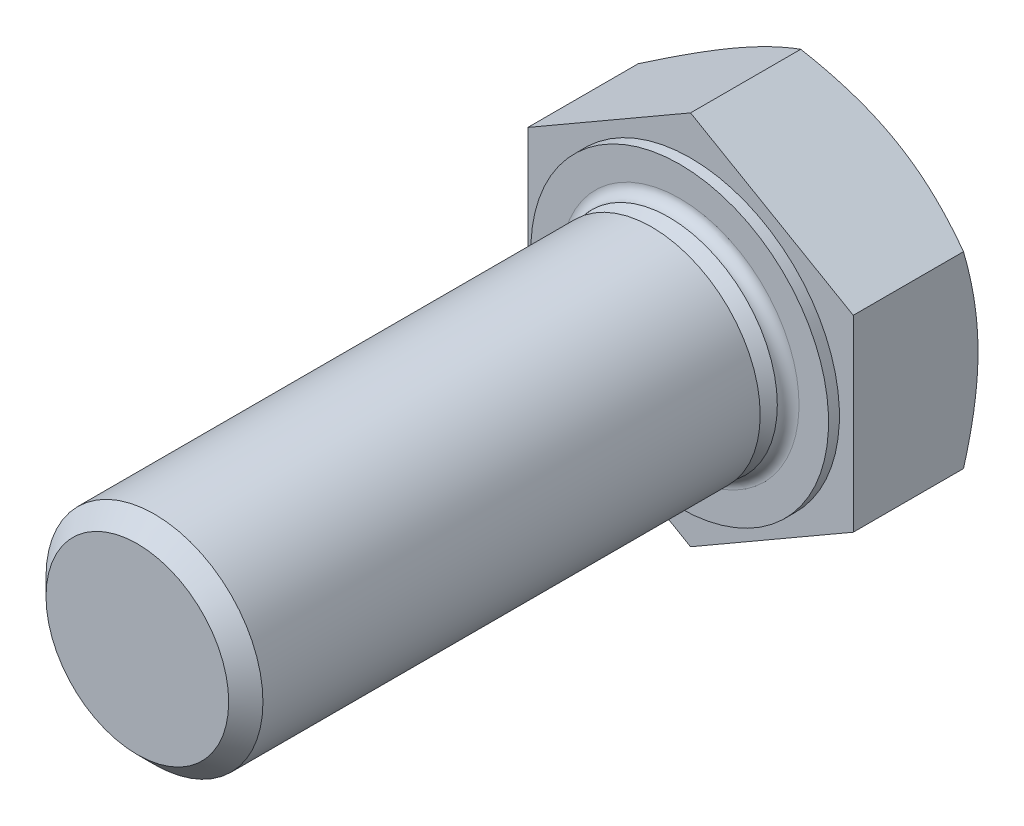
ISO-10303-21;
HEADER;
FILE_DESCRIPTION(('STEP AP214'),'2;1');
FILE_NAME('part.step','',(''),(''),'','','');
FILE_SCHEMA(('AUTOMOTIVE_DESIGN { 1 0 10303 214 1 1 1 1 }'));
ENDSEC;
DATA;
#1=APPLICATION_CONTEXT('core data for automotive mechanical design processes');
#2=APPLICATION_PROTOCOL_DEFINITION('international standard','automotive_design',2000,#1);
#3=PRODUCT_CONTEXT('',#1,'mechanical');
#4=PRODUCT('Part','Part','',(#3));
#5=PRODUCT_RELATED_PRODUCT_CATEGORY('part','',(#4));
#6=PRODUCT_DEFINITION_FORMATION('','',#4);
#7=PRODUCT_DEFINITION_CONTEXT('part definition',#1,'design');
#8=PRODUCT_DEFINITION('design','',#6,#7);
#9=PRODUCT_DEFINITION_SHAPE('','',#8);
#10=(LENGTH_UNIT() NAMED_UNIT(*) SI_UNIT(.MILLI.,.METRE.));
#11=(NAMED_UNIT(*) PLANE_ANGLE_UNIT() SI_UNIT($,.RADIAN.));
#12=(NAMED_UNIT(*) SI_UNIT($,.STERADIAN.) SOLID_ANGLE_UNIT());
#13=UNCERTAINTY_MEASURE_WITH_UNIT(LENGTH_MEASURE(1.E-05),#10,'distance_accuracy_value','');
#14=(GEOMETRIC_REPRESENTATION_CONTEXT(3) GLOBAL_UNCERTAINTY_ASSIGNED_CONTEXT((#13)) GLOBAL_UNIT_ASSIGNED_CONTEXT((#10,
#11,#12)) REPRESENTATION_CONTEXT('',''));
#15=CARTESIAN_POINT('',(0.,0.,0.));
#16=DIRECTION('',(0.,0.,1.));
#17=DIRECTION('',(1.,0.,0.));
#18=AXIS2_PLACEMENT_3D('',#15,#16,#17);
#19=CARTESIAN_POINT('',(0.,2.52640625,30.));
#20=DIRECTION('',(0.,0.,1.));
#21=DIRECTION('',(0.,1.,0.));
#22=AXIS2_PLACEMENT_3D('',#19,#20,#21);
#23=PLANE('',#22);
#24=CARTESIAN_POINT('',(0.,0.,30.));
#25=DIRECTION('',(0.,0.,1.));
#26=DIRECTION('',(0.,1.,0.));
#27=AXIS2_PLACEMENT_3D('',#24,#25,#26);
#28=CIRCLE('',#27,5.0528125);
#29=CARTESIAN_POINT('',(0.,5.0528125,30.));
#30=VERTEX_POINT('',#29);
#31=EDGE_CURVE('E9',#30,#30,#28,.T.);
#32=ORIENTED_EDGE('',*,*,#31,.T.);
#33=EDGE_LOOP('',(#32));
#34=FACE_BOUND('',#33,.T.);
#35=ADVANCED_FACE('F15',(#34),#23,.T.);
#36=CARTESIAN_POINT('',(0.,0.,29.52640625));
#37=DIRECTION('',(0.,0.,-1.));
#38=DIRECTION('',(0.,1.,0.));
#39=AXIS2_PLACEMENT_3D('',#36,#37,#38);
#40=CONICAL_SURFACE('',#39,5.52640625,0.785398163397449);
#41=CARTESIAN_POINT('',(0.,0.,29.0528125));
#42=DIRECTION('',(0.,0.,1.));
#43=DIRECTION('',(0.,1.,0.));
#44=AXIS2_PLACEMENT_3D('',#41,#42,#43);
#45=CIRCLE('',#44,6.);
#46=CARTESIAN_POINT('',(0.,6.,29.0528125));
#47=VERTEX_POINT('',#46);
#48=EDGE_CURVE('E24',#47,#47,#45,.T.);
#49=ORIENTED_EDGE('',*,*,#48,.T.);
#50=EDGE_LOOP('',(#49));
#51=FACE_BOUND('',#50,.T.);
#52=ORIENTED_EDGE('',*,*,#31,.F.);
#53=EDGE_LOOP('',(#52));
#54=FACE_BOUND('',#53,.T.);
#55=ADVANCED_FACE('F275',(#51,#54),#40,.T.);
#56=CARTESIAN_POINT('',(0.,0.,15.3));
#57=DIRECTION('',(0.,0.,-1.));
#58=DIRECTION('',(0.,1.,0.));
#59=AXIS2_PLACEMENT_3D('',#56,#57,#58);
#60=CYLINDRICAL_SURFACE('',#59,6.);
#61=CARTESIAN_POINT('',(0.,0.,1.5471875));
#62=DIRECTION('',(0.,0.,1.));
#63=DIRECTION('',(0.,1.,0.));
#64=AXIS2_PLACEMENT_3D('',#61,#62,#63);
#65=CIRCLE('',#64,6.);
#66=CARTESIAN_POINT('',(0.,6.,1.5471875));
#67=VERTEX_POINT('',#66);
#68=EDGE_CURVE('E110',#67,#67,#65,.T.);
#69=ORIENTED_EDGE('',*,*,#68,.T.);
#70=EDGE_LOOP('',(#69));
#71=FACE_BOUND('',#70,.T.);
#72=ORIENTED_EDGE('',*,*,#48,.F.);
#73=EDGE_LOOP('',(#72));
#74=FACE_BOUND('',#73,.T.);
#75=ADVANCED_FACE('F280',(#71,#74),#60,.T.);
#76=CARTESIAN_POINT('',(0.,5.52640625,1.5471875));
#77=DIRECTION('',(0.,0.,-1.));
#78=DIRECTION('',(0.,-1.,0.));
#79=AXIS2_PLACEMENT_3D('',#76,#77,#78);
#80=PLANE('',#79);
#81=CARTESIAN_POINT('',(0.,0.,1.5471875));
#82=DIRECTION('',(0.,0.,1.));
#83=DIRECTION('',(0.,1.,0.));
#84=AXIS2_PLACEMENT_3D('',#81,#82,#83);
#85=CIRCLE('',#84,5.0528125);
#86=CARTESIAN_POINT('',(0.,5.0528125,1.5471875));
#87=VERTEX_POINT('',#86);
#88=EDGE_CURVE('E106',#87,#87,#85,.T.);
#89=ORIENTED_EDGE('',*,*,#88,.T.);
#90=EDGE_LOOP('',(#89));
#91=FACE_BOUND('',#90,.T.);
#92=ORIENTED_EDGE('',*,*,#68,.F.);
#93=EDGE_LOOP('',(#92));
#94=FACE_BOUND('',#93,.T.);
#95=ADVANCED_FACE('F107',(#91,#94),#80,.T.);
#96=CARTESIAN_POINT('',(0.,0.,1.07359375));
#97=DIRECTION('',(0.,0.,-1.));
#98=DIRECTION('',(0.,1.,0.));
#99=AXIS2_PLACEMENT_3D('',#96,#97,#98);
#100=CONICAL_SURFACE('',#99,5.52640625,0.785398163397448);
#101=CARTESIAN_POINT('',(0.,0.,0.6));
#102=DIRECTION('',(0.,0.,1.));
#103=DIRECTION('',(0.,1.,0.));
#104=AXIS2_PLACEMENT_3D('',#101,#102,#103);
#105=CIRCLE('',#104,6.);
#106=CARTESIAN_POINT('',(0.,6.,0.6));
#107=VERTEX_POINT('',#106);
#108=EDGE_CURVE('E111',#107,#107,#105,.T.);
#109=ORIENTED_EDGE('',*,*,#108,.T.);
#110=EDGE_LOOP('',(#109));
#111=FACE_BOUND('',#110,.T.);
#112=ORIENTED_EDGE('',*,*,#88,.F.);
#113=EDGE_LOOP('',(#112));
#114=FACE_BOUND('',#113,.T.);
#115=ADVANCED_FACE('F271',(#111,#114),#100,.T.);
#116=CARTESIAN_POINT('',(0.,0.,0.6));
#117=DIRECTION('',(0.,0.,1.));
#118=DIRECTION('',(1.,0.,0.));
#119=AXIS2_PLACEMENT_3D('',#116,#117,#118);
#120=TOROIDAL_SURFACE('',#119,6.6,0.6);
#121=CARTESIAN_POINT('',(0.,0.,0.));
#122=DIRECTION('',(0.,0.,1.));
#123=DIRECTION('',(0.,1.,0.));
#124=AXIS2_PLACEMENT_3D('',#121,#122,#123);
#125=CIRCLE('',#124,6.6);
#126=CARTESIAN_POINT('',(0.,6.6,0.));
#127=VERTEX_POINT('',#126);
#128=EDGE_CURVE('E114',#127,#127,#125,.T.);
#129=ORIENTED_EDGE('',*,*,#128,.T.);
#130=EDGE_LOOP('',(#129));
#131=FACE_BOUND('',#130,.T.);
#132=ORIENTED_EDGE('',*,*,#108,.F.);
#133=EDGE_LOOP('',(#132));
#134=FACE_BOUND('',#133,.T.);
#135=ADVANCED_FACE('F257',(#131,#134),#120,.F.);
#136=CARTESIAN_POINT('',(0.,7.4175,0.));
#137=DIRECTION('',(0.,0.,1.));
#138=DIRECTION('',(0.,1.,0.));
#139=AXIS2_PLACEMENT_3D('',#136,#137,#138);
#140=PLANE('',#139);
#141=CARTESIAN_POINT('',(0.,0.,0.));
#142=DIRECTION('',(0.,0.,1.));
#143=DIRECTION('',(0.,1.,0.));
#144=AXIS2_PLACEMENT_3D('',#141,#142,#143);
#145=CIRCLE('',#144,8.235);
#146=CARTESIAN_POINT('',(0.,8.235,0.));
#147=VERTEX_POINT('',#146);
#148=EDGE_CURVE('E148',#147,#147,#145,.T.);
#149=ORIENTED_EDGE('',*,*,#148,.T.);
#150=EDGE_LOOP('',(#149));
#151=FACE_BOUND('',#150,.T.);
#152=ORIENTED_EDGE('',*,*,#128,.F.);
#153=EDGE_LOOP('',(#152));
#154=FACE_BOUND('',#153,.T.);
#155=ADVANCED_FACE('F260',(#151,#154),#140,.T.);
#156=CARTESIAN_POINT('',(0.,0.,-0.55));
#157=DIRECTION('',(0.,0.,-1.));
#158=DIRECTION('',(0.,1.,0.));
#159=AXIS2_PLACEMENT_3D('',#156,#157,#158);
#160=CYLINDRICAL_SURFACE('',#159,8.235);
#161=ORIENTED_EDGE('',*,*,#148,.F.);
#162=EDGE_LOOP('',(#161));
#163=FACE_BOUND('',#162,.T.);
#164=CARTESIAN_POINT('',(0.,0.,-0.6));
#165=DIRECTION('',(0.,0.,1.));
#166=DIRECTION('',(0.,1.,0.));
#167=AXIS2_PLACEMENT_3D('',#164,#165,#166);
#168=CIRCLE('',#167,8.235);
#169=CARTESIAN_POINT('',(0.,-8.235,-0.6));
#170=VERTEX_POINT('',#169);
#171=EDGE_CURVE('E161',#170,#170,#168,.T.);
#172=ORIENTED_EDGE('',*,*,#171,.T.);
#173=EDGE_LOOP('',(#172));
#174=FACE_BOUND('',#173,.T.);
#175=ADVANCED_FACE('F17',(#163,#174),#160,.T.);
#176=CARTESIAN_POINT('',(-4.5,-7.79422863405995,0.4));
#177=DIRECTION('',(-0.5,-0.866025403784439,0.));
#178=DIRECTION('',(-0.866025403784439,0.5,0.));
#179=AXIS2_PLACEMENT_3D('',#176,#177,#178);
#180=PLANE('',#179);
#181=CARTESIAN_POINT('',(0.00466633059542045,-10.3949989526387,-6.69459637448047));
#182=CARTESIAN_POINT('',(-2.4096675960114,-9.00108261019856,-7.49999999999999));
#183=CARTESIAN_POINT('',(-4.5,-7.79422863405995,-7.5));
#184=CARTESIAN_POINT('',(-6.59033240398861,-6.58737465792134,-7.50000000000001));
#185=CARTESIAN_POINT('',(-9.00466633059542,-5.19345831548124,-6.69459637448047));
#186=(BOUNDED_CURVE() B_SPLINE_CURVE(2,(#181,#182,#183,#184,#185),.UNSPECIFIED.,.F.,
.F.) B_SPLINE_CURVE_WITH_KNOTS((3,2,3),(0.,5.27698475776278,10.5539695155256),
.UNSPECIFIED.) CURVE() GEOMETRIC_REPRESENTATION_ITEM() RATIONAL_B_SPLINE_CURVE((1.,
1.03802697460135,1.,1.03802697460134,1.)) REPRESENTATION_ITEM(''));
#187=CARTESIAN_POINT('',(0.,-10.3923048454133,-6.69615242270663));
#188=VERTEX_POINT('',#187);
#189=CARTESIAN_POINT('',(-4.5,-7.79422863405995,-7.5));
#190=VERTEX_POINT('',#189);
#191=EDGE_CURVE('E202',#188,#190,#186,.T.);
#192=ORIENTED_EDGE('',*,*,#191,.F.);
#193=DIRECTION('',(0.,0.,-1.));
#194=VECTOR('',#193,1.);
#195=CARTESIAN_POINT('',(0.,-10.3923048454133,0.4));
#196=LINE('',#195,#194);
#197=CARTESIAN_POINT('',(0.,-10.3923048454133,-0.6));
#198=VERTEX_POINT('',#197);
#199=EDGE_CURVE('E150',#198,#188,#196,.T.);
#200=ORIENTED_EDGE('',*,*,#199,.F.);
#201=DIRECTION('',(0.866025403784439,-0.5,0.));
#202=VECTOR('',#201,1.);
#203=CARTESIAN_POINT('',(-3.3747082409576,-8.44391613405995,-0.6));
#204=LINE('',#203,#202);
#205=CARTESIAN_POINT('',(-9.,-5.19615242270663,-0.6));
#206=VERTEX_POINT('',#205);
#207=EDGE_CURVE('E155',#206,#198,#204,.T.);
#208=ORIENTED_EDGE('',*,*,#207,.F.);
#209=DIRECTION('',(0.,0.,-1.));
#210=VECTOR('',#209,1.);
#211=CARTESIAN_POINT('',(-9.,-5.19615242270663,0.4));
#212=LINE('',#211,#210);
#213=CARTESIAN_POINT('',(-9.,-5.19615242270663,-6.69615242270663));
#214=VERTEX_POINT('',#213);
#215=EDGE_CURVE('E129',#206,#214,#212,.T.);
#216=ORIENTED_EDGE('',*,*,#215,.T.);
#217=CARTESIAN_POINT('',(0.00466633059542045,-10.3949989526387,-6.69459637448047));
#218=CARTESIAN_POINT('',(-2.4096675960114,-9.00108261019856,-7.49999999999999));
#219=CARTESIAN_POINT('',(-4.5,-7.79422863405995,-7.5));
#220=CARTESIAN_POINT('',(-6.59033240398861,-6.58737465792134,-7.50000000000001));
#221=CARTESIAN_POINT('',(-9.00466633059542,-5.19345831548124,-6.69459637448047));
#222=(BOUNDED_CURVE() B_SPLINE_CURVE(2,(#217,#218,#219,#220,#221),.UNSPECIFIED.,.F.,
.F.) B_SPLINE_CURVE_WITH_KNOTS((3,2,3),(0.,5.27698475776278,10.5539695155256),
.UNSPECIFIED.) CURVE() GEOMETRIC_REPRESENTATION_ITEM() RATIONAL_B_SPLINE_CURVE((1.,
1.03802697460135,1.,1.03802697460134,1.)) REPRESENTATION_ITEM(''));
#223=EDGE_CURVE('E172',#190,#214,#222,.T.);
#224=ORIENTED_EDGE('',*,*,#223,.F.);
#225=EDGE_LOOP('',(#192,#200,#208,#216,#224));
#226=FACE_BOUND('',#225,.T.);
#227=ADVANCED_FACE('F269',(#226),#180,.T.);
#228=CARTESIAN_POINT('',(9.,0.,0.4));
#229=DIRECTION('',(1.,0.,0.));
#230=DIRECTION('',(0.,-1.,0.));
#231=AXIS2_PLACEMENT_3D('',#228,#229,#230);
#232=PLANE('',#231);
#233=CARTESIAN_POINT('',(9.,5.20154063715742,-6.69459637448047));
#234=CARTESIAN_POINT('',(8.99999999999999,2.41370795227724,-7.5));
#235=CARTESIAN_POINT('',(9.,0.,-7.5));
#236=CARTESIAN_POINT('',(9.00000000000001,-2.41370795227723,-7.5));
#237=CARTESIAN_POINT('',(9.,-5.20154063715742,-6.69459637448047));
#238=(BOUNDED_CURVE() B_SPLINE_CURVE(2,(#233,#234,#235,#236,#237),.UNSPECIFIED.,.F.,
.F.) B_SPLINE_CURVE_WITH_KNOTS((3,2,3),(0.,5.27698475776278,10.5539695155256),
.UNSPECIFIED.) CURVE() GEOMETRIC_REPRESENTATION_ITEM() RATIONAL_B_SPLINE_CURVE((1.,
1.03802697460134,1.,1.03802697460134,1.)) REPRESENTATION_ITEM(''));
#239=CARTESIAN_POINT('',(9.,5.19615242270664,-6.69615242270663));
#240=VERTEX_POINT('',#239);
#241=CARTESIAN_POINT('',(9.,0.,-7.5));
#242=VERTEX_POINT('',#241);
#243=EDGE_CURVE('E135',#240,#242,#238,.T.);
#244=ORIENTED_EDGE('',*,*,#243,.F.);
#245=DIRECTION('',(0.,0.,-1.));
#246=VECTOR('',#245,1.);
#247=CARTESIAN_POINT('',(9.,5.19615242270664,0.4));
#248=LINE('',#247,#246);
#249=CARTESIAN_POINT('',(9.,5.19615242270664,-0.6));
#250=VERTEX_POINT('',#249);
#251=EDGE_CURVE('E127',#250,#240,#248,.T.);
#252=ORIENTED_EDGE('',*,*,#251,.F.);
#253=DIRECTION('',(0.,1.,0.));
#254=VECTOR('',#253,1.);
#255=CARTESIAN_POINT('',(9.,-2.59875,-0.6));
#256=LINE('',#255,#254);
#257=CARTESIAN_POINT('',(9.,-5.19615242270663,-0.6));
#258=VERTEX_POINT('',#257);
#259=EDGE_CURVE('E217',#258,#250,#256,.T.);
#260=ORIENTED_EDGE('',*,*,#259,.F.);
#261=DIRECTION('',(0.,0.,-1.));
#262=VECTOR('',#261,1.);
#263=CARTESIAN_POINT('',(9.,-5.19615242270663,0.4));
#264=LINE('',#263,#262);
#265=CARTESIAN_POINT('',(9.,-5.19615242270663,-6.69615242270663));
#266=VERTEX_POINT('',#265);
#267=EDGE_CURVE('E177',#258,#266,#264,.T.);
#268=ORIENTED_EDGE('',*,*,#267,.T.);
#269=CARTESIAN_POINT('',(9.,5.20154063715742,-6.69459637448047));
#270=CARTESIAN_POINT('',(8.99999999999999,2.41370795227724,-7.5));
#271=CARTESIAN_POINT('',(9.,0.,-7.5));
#272=CARTESIAN_POINT('',(9.00000000000001,-2.41370795227723,-7.5));
#273=CARTESIAN_POINT('',(9.,-5.20154063715742,-6.69459637448047));
#274=(BOUNDED_CURVE() B_SPLINE_CURVE(2,(#269,#270,#271,#272,#273),.UNSPECIFIED.,.F.,
.F.) B_SPLINE_CURVE_WITH_KNOTS((3,2,3),(0.,5.27698475776278,10.5539695155256),
.UNSPECIFIED.) CURVE() GEOMETRIC_REPRESENTATION_ITEM() RATIONAL_B_SPLINE_CURVE((1.,
1.03802697460134,1.,1.03802697460134,1.)) REPRESENTATION_ITEM(''));
#275=EDGE_CURVE('E140',#242,#266,#274,.T.);
#276=ORIENTED_EDGE('',*,*,#275,.F.);
#277=EDGE_LOOP('',(#244,#252,#260,#268,#276));
#278=FACE_BOUND('',#277,.T.);
#279=ADVANCED_FACE('F304',(#278),#232,.T.);
#280=CARTESIAN_POINT('',(4.5,-7.79422863405995,0.4));
#281=DIRECTION('',(0.5,-0.866025403784439,0.));
#282=DIRECTION('',(-0.866025403784439,-0.5,0.));
#283=AXIS2_PLACEMENT_3D('',#280,#281,#282);
#284=PLANE('',#283);
#285=CARTESIAN_POINT('',(9.00466633059542,-5.19345831548124,-6.69459637448047));
#286=CARTESIAN_POINT('',(6.5903324039886,-6.58737465792133,-7.5));
#287=CARTESIAN_POINT('',(4.5,-7.79422863405995,-7.5));
#288=CARTESIAN_POINT('',(2.40966759601141,-9.00108261019856,-7.5));
#289=CARTESIAN_POINT('',(-0.00466633059541883,-10.3949989526387,-6.69459637448047));
#290=(BOUNDED_CURVE() B_SPLINE_CURVE(2,(#285,#286,#287,#288,#289),.UNSPECIFIED.,.F.,
.F.) B_SPLINE_CURVE_WITH_KNOTS((3,2,3),(0.,5.27698475776278,10.5539695155256),
.UNSPECIFIED.) CURVE() GEOMETRIC_REPRESENTATION_ITEM() RATIONAL_B_SPLINE_CURVE((1.,
1.03802697460133,1.,1.03802697460134,1.)) REPRESENTATION_ITEM(''));
#291=CARTESIAN_POINT('',(4.5,-7.79422863405995,-7.5));
#292=VERTEX_POINT('',#291);
#293=EDGE_CURVE('E126',#266,#292,#290,.T.);
#294=ORIENTED_EDGE('',*,*,#293,.F.);
#295=ORIENTED_EDGE('',*,*,#267,.F.);
#296=DIRECTION('',(0.866025403784439,0.5,0.));
#297=VECTOR('',#296,1.);
#298=CARTESIAN_POINT('',(3.3747082409576,-8.44391613405995,-0.6));
#299=LINE('',#298,#297);
#300=EDGE_CURVE('E214',#198,#258,#299,.T.);
#301=ORIENTED_EDGE('',*,*,#300,.F.);
#302=ORIENTED_EDGE('',*,*,#199,.T.);
#303=CARTESIAN_POINT('',(9.00466633059542,-5.19345831548124,-6.69459637448047));
#304=CARTESIAN_POINT('',(6.5903324039886,-6.58737465792133,-7.5));
#305=CARTESIAN_POINT('',(4.5,-7.79422863405995,-7.5));
#306=CARTESIAN_POINT('',(2.40966759601141,-9.00108261019856,-7.5));
#307=CARTESIAN_POINT('',(-0.00466633059541883,-10.3949989526387,-6.69459637448047));
#308=(BOUNDED_CURVE() B_SPLINE_CURVE(2,(#303,#304,#305,#306,#307),.UNSPECIFIED.,.F.,
.F.) B_SPLINE_CURVE_WITH_KNOTS((3,2,3),(0.,5.27698475776278,10.5539695155256),
.UNSPECIFIED.) CURVE() GEOMETRIC_REPRESENTATION_ITEM() RATIONAL_B_SPLINE_CURVE((1.,
1.03802697460133,1.,1.03802697460134,1.)) REPRESENTATION_ITEM(''));
#309=EDGE_CURVE('E125',#292,#188,#308,.T.);
#310=ORIENTED_EDGE('',*,*,#309,.F.);
#311=EDGE_LOOP('',(#294,#295,#301,#302,#310));
#312=FACE_BOUND('',#311,.T.);
#313=ADVANCED_FACE('F317',(#312),#284,.T.);
#314=CARTESIAN_POINT('',(-9.,0.,0.4));
#315=DIRECTION('',(-1.,0.,0.));
#316=DIRECTION('',(0.,1.,0.));
#317=AXIS2_PLACEMENT_3D('',#314,#315,#316);
#318=PLANE('',#317);
#319=CARTESIAN_POINT('',(-9.,-5.20154063715742,-6.69459637448047));
#320=CARTESIAN_POINT('',(-9.,-2.41370795227722,-7.5));
#321=CARTESIAN_POINT('',(-9.,0.,-7.5));
#322=CARTESIAN_POINT('',(-9.,2.41370795227723,-7.5));
#323=CARTESIAN_POINT('',(-9.,5.20154063715742,-6.69459637448047));
#324=(BOUNDED_CURVE() B_SPLINE_CURVE(2,(#319,#320,#321,#322,#323),.UNSPECIFIED.,.F.,
.F.) B_SPLINE_CURVE_WITH_KNOTS((3,2,3),(0.,5.27698475776278,10.5539695155256),
.UNSPECIFIED.) CURVE() GEOMETRIC_REPRESENTATION_ITEM() RATIONAL_B_SPLINE_CURVE((1.,
1.03802697460134,1.,1.03802697460134,1.)) REPRESENTATION_ITEM(''));
#325=CARTESIAN_POINT('',(-9.,0.,-7.5));
#326=VERTEX_POINT('',#325);
#327=CARTESIAN_POINT('',(-9.,5.19615242270663,-6.69615242270663));
#328=VERTEX_POINT('',#327);
#329=EDGE_CURVE('E223',#326,#328,#324,.T.);
#330=ORIENTED_EDGE('',*,*,#329,.F.);
#331=CARTESIAN_POINT('',(-9.,-5.20154063715742,-6.69459637448047));
#332=CARTESIAN_POINT('',(-9.,-2.41370795227722,-7.5));
#333=CARTESIAN_POINT('',(-9.,0.,-7.5));
#334=CARTESIAN_POINT('',(-9.,2.41370795227723,-7.5));
#335=CARTESIAN_POINT('',(-9.,5.20154063715742,-6.69459637448047));
#336=(BOUNDED_CURVE() B_SPLINE_CURVE(2,(#331,#332,#333,#334,#335),.UNSPECIFIED.,.F.,
.F.) B_SPLINE_CURVE_WITH_KNOTS((3,2,3),(0.,5.27698475776278,10.5539695155256),
.UNSPECIFIED.) CURVE() GEOMETRIC_REPRESENTATION_ITEM() RATIONAL_B_SPLINE_CURVE((1.,
1.03802697460134,1.,1.03802697460134,1.)) REPRESENTATION_ITEM(''));
#337=EDGE_CURVE('E166',#214,#326,#336,.T.);
#338=ORIENTED_EDGE('',*,*,#337,.F.);
#339=ORIENTED_EDGE('',*,*,#215,.F.);
#340=DIRECTION('',(0.,-1.,0.));
#341=VECTOR('',#340,1.);
#342=CARTESIAN_POINT('',(-9.,-2.59875,-0.6));
#343=LINE('',#342,#341);
#344=CARTESIAN_POINT('',(-9.,5.19615242270663,-0.6));
#345=VERTEX_POINT('',#344);
#346=EDGE_CURVE('E162',#345,#206,#343,.T.);
#347=ORIENTED_EDGE('',*,*,#346,.F.);
#348=DIRECTION('',(0.,0.,-1.));
#349=VECTOR('',#348,1.);
#350=CARTESIAN_POINT('',(-9.,5.19615242270663,0.4));
#351=LINE('',#350,#349);
#352=EDGE_CURVE('E180',#345,#328,#351,.T.);
#353=ORIENTED_EDGE('',*,*,#352,.T.);
#354=EDGE_LOOP('',(#330,#338,#339,#347,#353));
#355=FACE_BOUND('',#354,.T.);
#356=ADVANCED_FACE('F320',(#355),#318,.T.);
#357=CARTESIAN_POINT('',(4.5,7.79422863405995,0.4));
#358=DIRECTION('',(0.5,0.866025403784439,0.));
#359=DIRECTION('',(0.866025403784439,-0.5,0.));
#360=AXIS2_PLACEMENT_3D('',#357,#358,#359);
#361=PLANE('',#360);
#362=CARTESIAN_POINT('',(-0.00466633059542454,10.3949989526387,-6.69459637448047));
#363=CARTESIAN_POINT('',(2.40966759601141,9.00108261019857,-7.50000000000001));
#364=CARTESIAN_POINT('',(4.5,7.79422863405995,-7.5));
#365=CARTESIAN_POINT('',(6.59033240398859,6.58737465792134,-7.5));
#366=CARTESIAN_POINT('',(9.00466633059542,5.19345831548124,-6.69459637448047));
#367=(BOUNDED_CURVE() B_SPLINE_CURVE(2,(#362,#363,#364,#365,#366),.UNSPECIFIED.,.F.,
.F.) B_SPLINE_CURVE_WITH_KNOTS((3,2,3),(0.,5.27698475776278,10.5539695155256),
.UNSPECIFIED.) CURVE() GEOMETRIC_REPRESENTATION_ITEM() RATIONAL_B_SPLINE_CURVE((1.,
1.03802697460134,1.,1.03802697460133,1.)) REPRESENTATION_ITEM(''));
#368=CARTESIAN_POINT('',(4.5,7.79422863405995,-7.5));
#369=VERTEX_POINT('',#368);
#370=EDGE_CURVE('E134',#369,#240,#367,.T.);
#371=ORIENTED_EDGE('',*,*,#370,.F.);
#372=CARTESIAN_POINT('',(-0.00466633059542454,10.3949989526387,-6.69459637448047));
#373=CARTESIAN_POINT('',(2.40966759601141,9.00108261019857,-7.50000000000001));
#374=CARTESIAN_POINT('',(4.5,7.79422863405995,-7.5));
#375=CARTESIAN_POINT('',(6.59033240398859,6.58737465792134,-7.5));
#376=CARTESIAN_POINT('',(9.00466633059542,5.19345831548124,-6.69459637448047));
#377=(BOUNDED_CURVE() B_SPLINE_CURVE(2,(#372,#373,#374,#375,#376),.UNSPECIFIED.,.F.,
.F.) B_SPLINE_CURVE_WITH_KNOTS((3,2,3),(0.,5.27698475776278,10.5539695155256),
.UNSPECIFIED.) CURVE() GEOMETRIC_REPRESENTATION_ITEM() RATIONAL_B_SPLINE_CURVE((1.,
1.03802697460134,1.,1.03802697460133,1.)) REPRESENTATION_ITEM(''));
#378=CARTESIAN_POINT('',(0.,10.3923048454133,-6.69615242270663));
#379=VERTEX_POINT('',#378);
#380=EDGE_CURVE('E118',#379,#369,#377,.T.);
#381=ORIENTED_EDGE('',*,*,#380,.F.);
#382=DIRECTION('',(0.,0.,-1.));
#383=VECTOR('',#382,1.);
#384=CARTESIAN_POINT('',(0.,10.3923048454133,0.4));
#385=LINE('',#384,#383);
#386=CARTESIAN_POINT('',(0.,10.3923048454133,-0.6));
#387=VERTEX_POINT('',#386);
#388=EDGE_CURVE('E130',#387,#379,#385,.T.);
#389=ORIENTED_EDGE('',*,*,#388,.F.);
#390=DIRECTION('',(-0.866025403784439,0.5,0.));
#391=VECTOR('',#390,1.);
#392=CARTESIAN_POINT('',(5.6252917590424,7.14454113405995,-0.6));
#393=LINE('',#392,#391);
#394=EDGE_CURVE('E218',#250,#387,#393,.T.);
#395=ORIENTED_EDGE('',*,*,#394,.F.);
#396=ORIENTED_EDGE('',*,*,#251,.T.);
#397=EDGE_LOOP('',(#371,#381,#389,#395,#396));
#398=FACE_BOUND('',#397,.T.);
#399=ADVANCED_FACE('F283',(#398),#361,.T.);
#400=CARTESIAN_POINT('',(-4.5,7.79422863405995,0.4));
#401=DIRECTION('',(-0.5,0.866025403784439,0.));
#402=DIRECTION('',(0.866025403784439,0.5,0.));
#403=AXIS2_PLACEMENT_3D('',#400,#401,#402);
#404=PLANE('',#403);
#405=CARTESIAN_POINT('',(-9.00466633059543,5.19345831548123,-6.69459637448047));
#406=CARTESIAN_POINT('',(-6.5903324039886,6.58737465792133,-7.5));
#407=CARTESIAN_POINT('',(-4.5,7.79422863405994,-7.5));
#408=CARTESIAN_POINT('',(-2.40966759601141,9.00108261019856,-7.50000000000001));
#409=CARTESIAN_POINT('',(0.00466633059542045,10.3949989526387,-6.69459637448047));
#410=(BOUNDED_CURVE() B_SPLINE_CURVE(2,(#405,#406,#407,#408,#409),.UNSPECIFIED.,.F.,
.F.) B_SPLINE_CURVE_WITH_KNOTS((3,2,3),(0.,5.27698475776279,10.5539695155256),
.UNSPECIFIED.) CURVE() GEOMETRIC_REPRESENTATION_ITEM() RATIONAL_B_SPLINE_CURVE((1.,
1.03802697460135,1.,1.03802697460134,1.)) REPRESENTATION_ITEM(''));
#411=CARTESIAN_POINT('',(-4.5,7.79422863405994,-7.5));
#412=VERTEX_POINT('',#411);
#413=EDGE_CURVE('E147',#412,#379,#410,.T.);
#414=ORIENTED_EDGE('',*,*,#413,.F.);
#415=CARTESIAN_POINT('',(-9.00466633059543,5.19345831548123,-6.69459637448047));
#416=CARTESIAN_POINT('',(-6.5903324039886,6.58737465792133,-7.5));
#417=CARTESIAN_POINT('',(-4.5,7.79422863405994,-7.5));
#418=CARTESIAN_POINT('',(-2.40966759601141,9.00108261019856,-7.50000000000001));
#419=CARTESIAN_POINT('',(0.00466633059542045,10.3949989526387,-6.69459637448047));
#420=(BOUNDED_CURVE() B_SPLINE_CURVE(2,(#415,#416,#417,#418,#419),.UNSPECIFIED.,.F.,
.F.) B_SPLINE_CURVE_WITH_KNOTS((3,2,3),(0.,5.27698475776279,10.5539695155256),
.UNSPECIFIED.) CURVE() GEOMETRIC_REPRESENTATION_ITEM() RATIONAL_B_SPLINE_CURVE((1.,
1.03802697460135,1.,1.03802697460134,1.)) REPRESENTATION_ITEM(''));
#421=EDGE_CURVE('E185',#328,#412,#420,.T.);
#422=ORIENTED_EDGE('',*,*,#421,.F.);
#423=ORIENTED_EDGE('',*,*,#352,.F.);
#424=DIRECTION('',(-0.866025403784439,-0.5,0.));
#425=VECTOR('',#424,1.);
#426=CARTESIAN_POINT('',(-5.62529175904241,7.14454113405994,-0.6));
#427=LINE('',#426,#425);
#428=EDGE_CURVE('E165',#387,#345,#427,.T.);
#429=ORIENTED_EDGE('',*,*,#428,.F.);
#430=ORIENTED_EDGE('',*,*,#388,.T.);
#431=EDGE_LOOP('',(#414,#422,#423,#429,#430));
#432=FACE_BOUND('',#431,.T.);
#433=ADVANCED_FACE('F284',(#432),#404,.T.);
#434=CARTESIAN_POINT('',(0.,-4.5,-7.5));
#435=DIRECTION('',(0.,0.,-1.));
#436=DIRECTION('',(0.,-1.,0.));
#437=AXIS2_PLACEMENT_3D('',#434,#435,#436);
#438=PLANE('',#437);
#439=CARTESIAN_POINT('',(0.,0.,-7.5));
#440=DIRECTION('',(0.,0.,-1.));
#441=DIRECTION('',(0.,-1.,0.));
#442=AXIS2_PLACEMENT_3D('',#439,#440,#441);
#443=CIRCLE('',#442,9.);
#444=EDGE_CURVE('E19',#292,#190,#443,.T.);
#445=ORIENTED_EDGE('',*,*,#444,.T.);
#446=CARTESIAN_POINT('',(0.,0.,-7.5));
#447=DIRECTION('',(0.,0.,-1.));
#448=DIRECTION('',(0.,-1.,0.));
#449=AXIS2_PLACEMENT_3D('',#446,#447,#448);
#450=CIRCLE('',#449,9.);
#451=EDGE_CURVE('E171',#190,#326,#450,.T.);
#452=ORIENTED_EDGE('',*,*,#451,.T.);
#453=CARTESIAN_POINT('',(0.,0.,-7.5));
#454=DIRECTION('',(0.,0.,-1.));
#455=DIRECTION('',(0.,-1.,0.));
#456=AXIS2_PLACEMENT_3D('',#453,#454,#455);
#457=CIRCLE('',#456,9.);
#458=EDGE_CURVE('E193',#326,#412,#457,.T.);
#459=ORIENTED_EDGE('',*,*,#458,.T.);
#460=CARTESIAN_POINT('',(0.,0.,-7.5));
#461=DIRECTION('',(0.,0.,-1.));
#462=DIRECTION('',(0.,-1.,0.));
#463=AXIS2_PLACEMENT_3D('',#460,#461,#462);
#464=CIRCLE('',#463,9.);
#465=EDGE_CURVE('E141',#412,#369,#464,.T.);
#466=ORIENTED_EDGE('',*,*,#465,.T.);
#467=CARTESIAN_POINT('',(0.,0.,-7.5));
#468=DIRECTION('',(0.,0.,-1.));
#469=DIRECTION('',(0.,-1.,0.));
#470=AXIS2_PLACEMENT_3D('',#467,#468,#469);
#471=CIRCLE('',#470,9.);
#472=EDGE_CURVE('E131',#369,#242,#471,.T.);
#473=ORIENTED_EDGE('',*,*,#472,.T.);
#474=CARTESIAN_POINT('',(0.,0.,-7.5));
#475=DIRECTION('',(0.,0.,-1.));
#476=DIRECTION('',(0.,-1.,0.));
#477=AXIS2_PLACEMENT_3D('',#474,#475,#476);
#478=CIRCLE('',#477,9.);
#479=EDGE_CURVE('E122',#242,#292,#478,.T.);
#480=ORIENTED_EDGE('',*,*,#479,.T.);
#481=EDGE_LOOP('',(#445,#452,#459,#466,#473,#480));
#482=FACE_BOUND('',#481,.T.);
#483=ADVANCED_FACE('F287',(#482),#438,.T.);
#484=CARTESIAN_POINT('',(0.,0.,-7.09729818724024));
#485=DIRECTION('',(0.,0.,1.));
#486=DIRECTION('',(0.,-1.,0.));
#487=AXIS2_PLACEMENT_3D('',#484,#485,#486);
#488=CONICAL_SURFACE('',#487,9.6975,1.0471975511966);
#489=ORIENTED_EDGE('',*,*,#223,.T.);
#490=ORIENTED_EDGE('',*,*,#337,.T.);
#491=ORIENTED_EDGE('',*,*,#451,.F.);
#492=EDGE_LOOP('',(#489,#490,#491));
#493=FACE_BOUND('',#492,.T.);
#494=ADVANCED_FACE('F309',(#493),#488,.T.);
#495=CARTESIAN_POINT('',(0.,0.,-7.09729818724024));
#496=DIRECTION('',(0.,0.,1.));
#497=DIRECTION('',(0.,-1.,0.));
#498=AXIS2_PLACEMENT_3D('',#495,#496,#497);
#499=CONICAL_SURFACE('',#498,9.6975,1.0471975511966);
#500=ORIENTED_EDGE('',*,*,#309,.T.);
#501=ORIENTED_EDGE('',*,*,#191,.T.);
#502=ORIENTED_EDGE('',*,*,#444,.F.);
#503=EDGE_LOOP('',(#500,#501,#502));
#504=FACE_BOUND('',#503,.T.);
#505=ADVANCED_FACE('F295',(#504),#499,.T.);
#506=CARTESIAN_POINT('',(0.,0.,-7.09729818724024));
#507=DIRECTION('',(0.,0.,1.));
#508=DIRECTION('',(0.,-1.,0.));
#509=AXIS2_PLACEMENT_3D('',#506,#507,#508);
#510=CONICAL_SURFACE('',#509,9.6975,1.0471975511966);
#511=ORIENTED_EDGE('',*,*,#275,.T.);
#512=ORIENTED_EDGE('',*,*,#293,.T.);
#513=ORIENTED_EDGE('',*,*,#479,.F.);
#514=EDGE_LOOP('',(#511,#512,#513));
#515=FACE_BOUND('',#514,.T.);
#516=ADVANCED_FACE('F291',(#515),#510,.T.);
#517=CARTESIAN_POINT('',(0.,0.,-7.09729818724024));
#518=DIRECTION('',(0.,0.,1.));
#519=DIRECTION('',(0.,-1.,0.));
#520=AXIS2_PLACEMENT_3D('',#517,#518,#519);
#521=CONICAL_SURFACE('',#520,9.6975,1.0471975511966);
#522=ORIENTED_EDGE('',*,*,#243,.T.);
#523=ORIENTED_EDGE('',*,*,#472,.F.);
#524=ORIENTED_EDGE('',*,*,#370,.T.);
#525=EDGE_LOOP('',(#522,#523,#524));
#526=FACE_BOUND('',#525,.T.);
#527=ADVANCED_FACE('F294',(#526),#521,.T.);
#528=CARTESIAN_POINT('',(0.,0.,-7.09729818724024));
#529=DIRECTION('',(0.,0.,1.));
#530=DIRECTION('',(0.,-1.,0.));
#531=AXIS2_PLACEMENT_3D('',#528,#529,#530);
#532=CONICAL_SURFACE('',#531,9.6975,1.0471975511966);
#533=ORIENTED_EDGE('',*,*,#380,.T.);
#534=ORIENTED_EDGE('',*,*,#465,.F.);
#535=ORIENTED_EDGE('',*,*,#413,.T.);
#536=EDGE_LOOP('',(#533,#534,#535));
#537=FACE_BOUND('',#536,.T.);
#538=ADVANCED_FACE('F313',(#537),#532,.T.);
#539=CARTESIAN_POINT('',(0.,0.,-7.09729818724024));
#540=DIRECTION('',(0.,0.,1.));
#541=DIRECTION('',(0.,-1.,0.));
#542=AXIS2_PLACEMENT_3D('',#539,#540,#541);
#543=CONICAL_SURFACE('',#542,9.6975,1.0471975511966);
#544=ORIENTED_EDGE('',*,*,#421,.T.);
#545=ORIENTED_EDGE('',*,*,#458,.F.);
#546=ORIENTED_EDGE('',*,*,#329,.T.);
#547=EDGE_LOOP('',(#544,#545,#546));
#548=FACE_BOUND('',#547,.T.);
#549=ADVANCED_FACE('F300',(#548),#543,.T.);
#550=CARTESIAN_POINT('',(0.,-5.1975,-0.6));
#551=DIRECTION('',(0.,0.,1.));
#552=DIRECTION('',(0.,1.,0.));
#553=AXIS2_PLACEMENT_3D('',#550,#551,#552);
#554=PLANE('',#553);
#555=ORIENTED_EDGE('',*,*,#171,.F.);
#556=EDGE_LOOP('',(#555));
#557=FACE_BOUND('',#556,.T.);
#558=ORIENTED_EDGE('',*,*,#300,.T.);
#559=ORIENTED_EDGE('',*,*,#259,.T.);
#560=ORIENTED_EDGE('',*,*,#394,.T.);
#561=ORIENTED_EDGE('',*,*,#428,.T.);
#562=ORIENTED_EDGE('',*,*,#346,.T.);
#563=ORIENTED_EDGE('',*,*,#207,.T.);
#564=EDGE_LOOP('',(#558,#559,#560,#561,#562,#563));
#565=FACE_BOUND('',#564,.T.);
#566=ADVANCED_FACE('F297',(#557,#565),#554,.T.);
#567=CLOSED_SHELL('',(#35,#55,#75,#95,#115,#135,#155,#175,#227,#279,#313,#356,#399,#433,#483,
#494,#505,#516,#527,#538,#549,#566));
#568=MANIFOLD_SOLID_BREP('B1',#567);
#569=ADVANCED_BREP_SHAPE_REPRESENTATION('',(#18,#568),#14);
#570=SHAPE_DEFINITION_REPRESENTATION(#9,#569);
ENDSEC;
END-ISO-10303-21;
